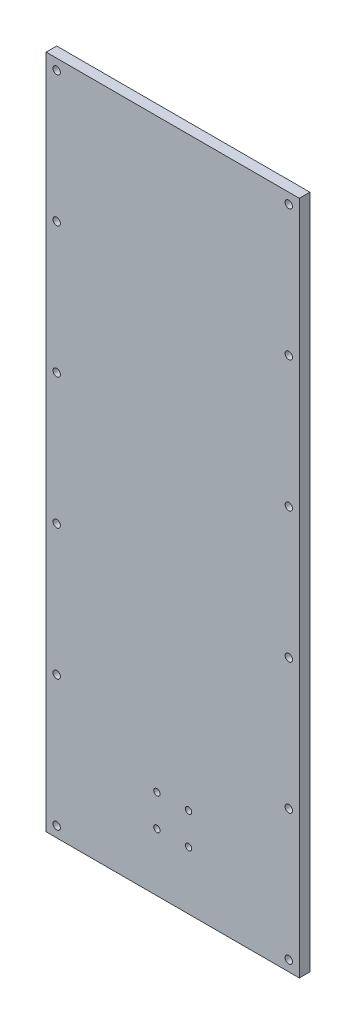
ISO-10303-21;
HEADER;
FILE_DESCRIPTION(('STEP AP214'),'2;1');
FILE_NAME('part.step','',(''),(''),'','','');
FILE_SCHEMA(('AUTOMOTIVE_DESIGN { 1 0 10303 214 1 1 1 1 }'));
ENDSEC;
DATA;
#1=APPLICATION_CONTEXT('core data for automotive mechanical design processes');
#2=APPLICATION_PROTOCOL_DEFINITION('international standard','automotive_design',2000,#1);
#3=PRODUCT_CONTEXT('',#1,'mechanical');
#4=PRODUCT('Part','Part','',(#3));
#5=PRODUCT_RELATED_PRODUCT_CATEGORY('part','',(#4));
#6=PRODUCT_DEFINITION_FORMATION('','',#4);
#7=PRODUCT_DEFINITION_CONTEXT('part definition',#1,'design');
#8=PRODUCT_DEFINITION('design','',#6,#7);
#9=PRODUCT_DEFINITION_SHAPE('','',#8);
#10=(LENGTH_UNIT() NAMED_UNIT(*) SI_UNIT(.MILLI.,.METRE.));
#11=(NAMED_UNIT(*) PLANE_ANGLE_UNIT() SI_UNIT($,.RADIAN.));
#12=(NAMED_UNIT(*) SI_UNIT($,.STERADIAN.) SOLID_ANGLE_UNIT());
#13=UNCERTAINTY_MEASURE_WITH_UNIT(LENGTH_MEASURE(1.E-05),#10,'distance_accuracy_value','');
#14=(GEOMETRIC_REPRESENTATION_CONTEXT(3) GLOBAL_UNCERTAINTY_ASSIGNED_CONTEXT((#13)) GLOBAL_UNIT_ASSIGNED_CONTEXT((#10,
#11,#12)) REPRESENTATION_CONTEXT('',''));
#15=CARTESIAN_POINT('',(0.,0.,0.));
#16=DIRECTION('',(0.,0.,1.));
#17=DIRECTION('',(1.,0.,0.));
#18=AXIS2_PLACEMENT_3D('',#15,#16,#17);
#19=CARTESIAN_POINT('',(-60.,-160.,5.));
#20=DIRECTION('',(1.,0.,0.));
#21=DIRECTION('',(0.,0.,-1.));
#22=AXIS2_PLACEMENT_3D('',#19,#20,#21);
#23=PLANE('',#22);
#24=DIRECTION('',(0.,-1.,0.));
#25=VECTOR('',#24,1.);
#26=CARTESIAN_POINT('',(-60.,-160.,0.));
#27=LINE('',#26,#25);
#28=CARTESIAN_POINT('',(-60.,160.,0.));
#29=VERTEX_POINT('',#28);
#30=CARTESIAN_POINT('',(-60.,-160.,0.));
#31=VERTEX_POINT('',#30);
#32=EDGE_CURVE('E101',#29,#31,#27,.T.);
#33=ORIENTED_EDGE('',*,*,#32,.T.);
#34=DIRECTION('',(0.,0.,-1.));
#35=VECTOR('',#34,1.);
#36=CARTESIAN_POINT('',(-60.,-160.,5.));
#37=LINE('',#36,#35);
#38=CARTESIAN_POINT('',(-60.,-160.,5.));
#39=VERTEX_POINT('',#38);
#40=EDGE_CURVE('E11',#39,#31,#37,.T.);
#41=ORIENTED_EDGE('',*,*,#40,.F.);
#42=DIRECTION('',(0.,-1.,0.));
#43=VECTOR('',#42,1.);
#44=CARTESIAN_POINT('',(-60.,-160.,5.));
#45=LINE('',#44,#43);
#46=CARTESIAN_POINT('',(-60.,160.,5.));
#47=VERTEX_POINT('',#46);
#48=EDGE_CURVE('E88',#47,#39,#45,.T.);
#49=ORIENTED_EDGE('',*,*,#48,.F.);
#50=DIRECTION('',(0.,0.,-1.));
#51=VECTOR('',#50,1.);
#52=CARTESIAN_POINT('',(-60.,160.,5.));
#53=LINE('',#52,#51);
#54=EDGE_CURVE('E97',#47,#29,#53,.T.);
#55=ORIENTED_EDGE('',*,*,#54,.T.);
#56=EDGE_LOOP('',(#33,#41,#49,#55));
#57=FACE_BOUND('',#56,.T.);
#58=ADVANCED_FACE('F35',(#57),#23,.F.);
#59=CARTESIAN_POINT('',(60.,-160.,5.));
#60=DIRECTION('',(0.,1.,0.));
#61=DIRECTION('',(0.,0.,1.));
#62=AXIS2_PLACEMENT_3D('',#59,#60,#61);
#63=PLANE('',#62);
#64=DIRECTION('',(1.,0.,0.));
#65=VECTOR('',#64,1.);
#66=CARTESIAN_POINT('',(60.,-160.,0.));
#67=LINE('',#66,#65);
#68=CARTESIAN_POINT('',(60.,-160.,0.));
#69=VERTEX_POINT('',#68);
#70=EDGE_CURVE('E92',#31,#69,#67,.T.);
#71=ORIENTED_EDGE('',*,*,#70,.T.);
#72=DIRECTION('',(0.,0.,-1.));
#73=VECTOR('',#72,1.);
#74=CARTESIAN_POINT('',(60.,-160.,5.));
#75=LINE('',#74,#73);
#76=CARTESIAN_POINT('',(60.,-160.,5.));
#77=VERTEX_POINT('',#76);
#78=EDGE_CURVE('E44',#77,#69,#75,.T.);
#79=ORIENTED_EDGE('',*,*,#78,.F.);
#80=DIRECTION('',(1.,0.,0.));
#81=VECTOR('',#80,1.);
#82=CARTESIAN_POINT('',(60.,-160.,5.));
#83=LINE('',#82,#81);
#84=EDGE_CURVE('E83',#39,#77,#83,.T.);
#85=ORIENTED_EDGE('',*,*,#84,.F.);
#86=ORIENTED_EDGE('',*,*,#40,.T.);
#87=EDGE_LOOP('',(#71,#79,#85,#86));
#88=FACE_BOUND('',#87,.T.);
#89=ADVANCED_FACE('F91',(#88),#63,.F.);
#90=CARTESIAN_POINT('',(60.,-160.,5.));
#91=DIRECTION('',(-1.,0.,0.));
#92=DIRECTION('',(0.,0.,1.));
#93=AXIS2_PLACEMENT_3D('',#90,#91,#92);
#94=PLANE('',#93);
#95=DIRECTION('',(0.,1.,0.));
#96=VECTOR('',#95,1.);
#97=CARTESIAN_POINT('',(60.,-160.,0.));
#98=LINE('',#97,#96);
#99=CARTESIAN_POINT('',(60.,160.,0.));
#100=VERTEX_POINT('',#99);
#101=EDGE_CURVE('E70',#69,#100,#98,.T.);
#102=ORIENTED_EDGE('',*,*,#101,.T.);
#103=DIRECTION('',(0.,0.,-1.));
#104=VECTOR('',#103,1.);
#105=CARTESIAN_POINT('',(60.,160.,5.));
#106=LINE('',#105,#104);
#107=CARTESIAN_POINT('',(60.,160.,5.));
#108=VERTEX_POINT('',#107);
#109=EDGE_CURVE('E93',#108,#100,#106,.T.);
#110=ORIENTED_EDGE('',*,*,#109,.F.);
#111=DIRECTION('',(0.,1.,0.));
#112=VECTOR('',#111,1.);
#113=CARTESIAN_POINT('',(60.,-160.,5.));
#114=LINE('',#113,#112);
#115=EDGE_CURVE('E86',#77,#108,#114,.T.);
#116=ORIENTED_EDGE('',*,*,#115,.F.);
#117=ORIENTED_EDGE('',*,*,#78,.T.);
#118=EDGE_LOOP('',(#102,#110,#116,#117));
#119=FACE_BOUND('',#118,.T.);
#120=ADVANCED_FACE('F95',(#119),#94,.F.);
#121=CARTESIAN_POINT('',(60.,160.,5.));
#122=DIRECTION('',(0.,-1.,0.));
#123=DIRECTION('',(0.,0.,-1.));
#124=AXIS2_PLACEMENT_3D('',#121,#122,#123);
#125=PLANE('',#124);
#126=DIRECTION('',(-1.,0.,0.));
#127=VECTOR('',#126,1.);
#128=CARTESIAN_POINT('',(60.,160.,0.));
#129=LINE('',#128,#127);
#130=EDGE_CURVE('E76',#100,#29,#129,.T.);
#131=ORIENTED_EDGE('',*,*,#130,.T.);
#132=ORIENTED_EDGE('',*,*,#54,.F.);
#133=DIRECTION('',(-1.,0.,0.));
#134=VECTOR('',#133,1.);
#135=CARTESIAN_POINT('',(60.,160.,5.));
#136=LINE('',#135,#134);
#137=EDGE_CURVE('E53',#108,#47,#136,.T.);
#138=ORIENTED_EDGE('',*,*,#137,.F.);
#139=ORIENTED_EDGE('',*,*,#109,.T.);
#140=EDGE_LOOP('',(#131,#132,#138,#139));
#141=FACE_BOUND('',#140,.T.);
#142=ADVANCED_FACE('F190',(#141),#125,.F.);
#143=CARTESIAN_POINT('',(0.,0.,5.));
#144=DIRECTION('',(0.,0.,1.));
#145=DIRECTION('',(1.,0.,0.));
#146=AXIS2_PLACEMENT_3D('',#143,#144,#145);
#147=PLANE('',#146);
#148=CARTESIAN_POINT('',(55.,93.,5.));
#149=DIRECTION('',(0.,0.,1.));
#150=DIRECTION('',(-1.,0.,0.));
#151=AXIS2_PLACEMENT_3D('',#148,#149,#150);
#152=CIRCLE('',#151,1.74759299465095);
#153=CARTESIAN_POINT('',(53.2524070053491,93.,5.));
#154=VERTEX_POINT('',#153);
#155=EDGE_CURVE('E415',#154,#154,#152,.T.);
#156=ORIENTED_EDGE('',*,*,#155,.F.);
#157=EDGE_LOOP('',(#156));
#158=FACE_BOUND('',#157,.T.);
#159=CARTESIAN_POINT('',(55.,-155.,5.));
#160=DIRECTION('',(0.,0.,1.));
#161=DIRECTION('',(-1.,0.,0.));
#162=AXIS2_PLACEMENT_3D('',#159,#160,#161);
#163=CIRCLE('',#162,1.74759299465095);
#164=CARTESIAN_POINT('',(53.2524070053491,-155.,5.));
#165=VERTEX_POINT('',#164);
#166=EDGE_CURVE('E409',#165,#165,#163,.T.);
#167=ORIENTED_EDGE('',*,*,#166,.F.);
#168=EDGE_LOOP('',(#167));
#169=FACE_BOUND('',#168,.T.);
#170=CARTESIAN_POINT('',(-55.,-155.,5.));
#171=DIRECTION('',(0.,0.,1.));
#172=DIRECTION('',(1.,0.,0.));
#173=AXIS2_PLACEMENT_3D('',#170,#171,#172);
#174=CIRCLE('',#173,1.74759299465095);
#175=CARTESIAN_POINT('',(-53.2524070053491,-155.,5.));
#176=VERTEX_POINT('',#175);
#177=EDGE_CURVE('E365',#176,#176,#174,.T.);
#178=ORIENTED_EDGE('',*,*,#177,.F.);
#179=EDGE_LOOP('',(#178));
#180=FACE_BOUND('',#179,.T.);
#181=CARTESIAN_POINT('',(-55.,-93.,5.));
#182=DIRECTION('',(0.,0.,1.));
#183=DIRECTION('',(1.,0.,0.));
#184=AXIS2_PLACEMENT_3D('',#181,#182,#183);
#185=CIRCLE('',#184,1.74759299465095);
#186=CARTESIAN_POINT('',(-53.252407005349,-93.,5.));
#187=VERTEX_POINT('',#186);
#188=EDGE_CURVE('E408',#187,#187,#185,.T.);
#189=ORIENTED_EDGE('',*,*,#188,.F.);
#190=EDGE_LOOP('',(#189));
#191=FACE_BOUND('',#190,.T.);
#192=CARTESIAN_POINT('',(-55.,-31.,5.));
#193=DIRECTION('',(0.,0.,1.));
#194=DIRECTION('',(1.,0.,0.));
#195=AXIS2_PLACEMENT_3D('',#192,#193,#194);
#196=CIRCLE('',#195,1.74759299465095);
#197=CARTESIAN_POINT('',(-53.252407005349,-31.,5.));
#198=VERTEX_POINT('',#197);
#199=EDGE_CURVE('E412',#198,#198,#196,.T.);
#200=ORIENTED_EDGE('',*,*,#199,.F.);
#201=EDGE_LOOP('',(#200));
#202=FACE_BOUND('',#201,.T.);
#203=CARTESIAN_POINT('',(-55.,31.,5.));
#204=DIRECTION('',(0.,0.,1.));
#205=DIRECTION('',(1.,0.,0.));
#206=AXIS2_PLACEMENT_3D('',#203,#204,#205);
#207=CIRCLE('',#206,1.74759299465095);
#208=CARTESIAN_POINT('',(-53.252407005349,31.,5.));
#209=VERTEX_POINT('',#208);
#210=EDGE_CURVE('E427',#209,#209,#207,.T.);
#211=ORIENTED_EDGE('',*,*,#210,.F.);
#212=EDGE_LOOP('',(#211));
#213=FACE_BOUND('',#212,.T.);
#214=CARTESIAN_POINT('',(-55.,93.,5.));
#215=DIRECTION('',(0.,0.,1.));
#216=DIRECTION('',(1.,0.,0.));
#217=AXIS2_PLACEMENT_3D('',#214,#215,#216);
#218=CIRCLE('',#217,1.74759299465095);
#219=CARTESIAN_POINT('',(-53.2524070053491,93.,5.));
#220=VERTEX_POINT('',#219);
#221=EDGE_CURVE('E424',#220,#220,#218,.T.);
#222=ORIENTED_EDGE('',*,*,#221,.F.);
#223=EDGE_LOOP('',(#222));
#224=FACE_BOUND('',#223,.T.);
#225=CARTESIAN_POINT('',(55.,155.,5.));
#226=DIRECTION('',(0.,0.,1.));
#227=DIRECTION('',(1.,0.,0.));
#228=AXIS2_PLACEMENT_3D('',#225,#226,#227);
#229=CIRCLE('',#228,1.74759299465095);
#230=CARTESIAN_POINT('',(56.747592994651,155.,5.));
#231=VERTEX_POINT('',#230);
#232=EDGE_CURVE('E421',#231,#231,#229,.T.);
#233=ORIENTED_EDGE('',*,*,#232,.F.);
#234=EDGE_LOOP('',(#233));
#235=FACE_BOUND('',#234,.T.);
#236=CARTESIAN_POINT('',(-7.5,-132.5,5.));
#237=DIRECTION('',(0.,0.,1.));
#238=DIRECTION('',(1.,0.,0.));
#239=AXIS2_PLACEMENT_3D('',#236,#237,#238);
#240=CIRCLE('',#239,1.5);
#241=CARTESIAN_POINT('',(-6.,-132.5,5.));
#242=VERTEX_POINT('',#241);
#243=EDGE_CURVE('E447',#242,#242,#240,.T.);
#244=ORIENTED_EDGE('',*,*,#243,.F.);
#245=EDGE_LOOP('',(#244));
#246=FACE_BOUND('',#245,.T.);
#247=CARTESIAN_POINT('',(7.5,-132.5,5.));
#248=DIRECTION('',(0.,0.,1.));
#249=DIRECTION('',(1.,0.,0.));
#250=AXIS2_PLACEMENT_3D('',#247,#248,#249);
#251=CIRCLE('',#250,1.5);
#252=CARTESIAN_POINT('',(9.,-132.5,5.));
#253=VERTEX_POINT('',#252);
#254=EDGE_CURVE('E451',#253,#253,#251,.T.);
#255=ORIENTED_EDGE('',*,*,#254,.F.);
#256=EDGE_LOOP('',(#255));
#257=FACE_BOUND('',#256,.T.);
#258=CARTESIAN_POINT('',(7.5,-117.5,5.));
#259=DIRECTION('',(0.,0.,1.));
#260=DIRECTION('',(1.,0.,0.));
#261=AXIS2_PLACEMENT_3D('',#258,#259,#260);
#262=CIRCLE('',#261,1.5);
#263=CARTESIAN_POINT('',(9.,-117.5,5.));
#264=VERTEX_POINT('',#263);
#265=EDGE_CURVE('E455',#264,#264,#262,.T.);
#266=ORIENTED_EDGE('',*,*,#265,.F.);
#267=EDGE_LOOP('',(#266));
#268=FACE_BOUND('',#267,.T.);
#269=CARTESIAN_POINT('',(-7.5,-117.5,5.));
#270=DIRECTION('',(0.,0.,1.));
#271=DIRECTION('',(1.,0.,0.));
#272=AXIS2_PLACEMENT_3D('',#269,#270,#271);
#273=CIRCLE('',#272,1.5);
#274=CARTESIAN_POINT('',(-6.,-117.5,5.));
#275=VERTEX_POINT('',#274);
#276=EDGE_CURVE('E459',#275,#275,#273,.T.);
#277=ORIENTED_EDGE('',*,*,#276,.F.);
#278=EDGE_LOOP('',(#277));
#279=FACE_BOUND('',#278,.T.);
#280=CARTESIAN_POINT('',(55.,-93.,5.));
#281=DIRECTION('',(0.,0.,1.));
#282=DIRECTION('',(-1.,0.,0.));
#283=AXIS2_PLACEMENT_3D('',#280,#281,#282);
#284=CIRCLE('',#283,1.74759299465095);
#285=CARTESIAN_POINT('',(53.252407005349,-93.,5.));
#286=VERTEX_POINT('',#285);
#287=EDGE_CURVE('E463',#286,#286,#284,.T.);
#288=ORIENTED_EDGE('',*,*,#287,.F.);
#289=EDGE_LOOP('',(#288));
#290=FACE_BOUND('',#289,.T.);
#291=CARTESIAN_POINT('',(55.,-31.,5.));
#292=DIRECTION('',(0.,0.,1.));
#293=DIRECTION('',(-1.,0.,0.));
#294=AXIS2_PLACEMENT_3D('',#291,#292,#293);
#295=CIRCLE('',#294,1.74759299465095);
#296=CARTESIAN_POINT('',(53.252407005349,-31.,5.));
#297=VERTEX_POINT('',#296);
#298=EDGE_CURVE('E467',#297,#297,#295,.T.);
#299=ORIENTED_EDGE('',*,*,#298,.F.);
#300=EDGE_LOOP('',(#299));
#301=FACE_BOUND('',#300,.T.);
#302=CARTESIAN_POINT('',(55.,31.,5.));
#303=DIRECTION('',(0.,0.,1.));
#304=DIRECTION('',(-1.,0.,0.));
#305=AXIS2_PLACEMENT_3D('',#302,#303,#304);
#306=CIRCLE('',#305,1.74759299465095);
#307=CARTESIAN_POINT('',(53.252407005349,31.,5.));
#308=VERTEX_POINT('',#307);
#309=EDGE_CURVE('E420',#308,#308,#306,.T.);
#310=ORIENTED_EDGE('',*,*,#309,.F.);
#311=EDGE_LOOP('',(#310));
#312=FACE_BOUND('',#311,.T.);
#313=CARTESIAN_POINT('',(-55.,155.,5.));
#314=DIRECTION('',(0.,0.,1.));
#315=DIRECTION('',(1.,0.,0.));
#316=AXIS2_PLACEMENT_3D('',#313,#314,#315);
#317=CIRCLE('',#316,1.74759299465095);
#318=CARTESIAN_POINT('',(-53.2524070053491,155.,5.));
#319=VERTEX_POINT('',#318);
#320=EDGE_CURVE('E113',#319,#319,#317,.T.);
#321=ORIENTED_EDGE('',*,*,#320,.F.);
#322=EDGE_LOOP('',(#321));
#323=FACE_BOUND('',#322,.T.);
#324=ORIENTED_EDGE('',*,*,#48,.T.);
#325=ORIENTED_EDGE('',*,*,#84,.T.);
#326=ORIENTED_EDGE('',*,*,#115,.T.);
#327=ORIENTED_EDGE('',*,*,#137,.T.);
#328=EDGE_LOOP('',(#324,#325,#326,#327));
#329=FACE_BOUND('',#328,.T.);
#330=ADVANCED_FACE('F84',(#158,#169,#180,#191,#202,#213,#224,#235,#246,#257,#268,#279,#290,#301,
#312,#323,#329),#147,.T.);
#331=CARTESIAN_POINT('',(0.,0.,0.));
#332=DIRECTION('',(0.,0.,1.));
#333=DIRECTION('',(1.,0.,0.));
#334=AXIS2_PLACEMENT_3D('',#331,#332,#333);
#335=PLANE('',#334);
#336=CARTESIAN_POINT('',(55.,93.,0.));
#337=DIRECTION('',(0.,0.,1.));
#338=DIRECTION('',(1.,0.,0.));
#339=AXIS2_PLACEMENT_3D('',#336,#337,#338);
#340=CIRCLE('',#339,1.74759299465095);
#341=CARTESIAN_POINT('',(56.747592994651,93.,0.));
#342=VERTEX_POINT('',#341);
#343=EDGE_CURVE('E38',#342,#342,#340,.T.);
#344=ORIENTED_EDGE('',*,*,#343,.T.);
#345=EDGE_LOOP('',(#344));
#346=FACE_BOUND('',#345,.T.);
#347=CARTESIAN_POINT('',(55.,-155.,0.));
#348=DIRECTION('',(0.,0.,1.));
#349=DIRECTION('',(1.,0.,0.));
#350=AXIS2_PLACEMENT_3D('',#347,#348,#349);
#351=CIRCLE('',#350,1.74759299465095);
#352=CARTESIAN_POINT('',(56.747592994651,-155.,0.));
#353=VERTEX_POINT('',#352);
#354=EDGE_CURVE('E151',#353,#353,#351,.T.);
#355=ORIENTED_EDGE('',*,*,#354,.T.);
#356=EDGE_LOOP('',(#355));
#357=FACE_BOUND('',#356,.T.);
#358=CARTESIAN_POINT('',(-55.,-155.,0.));
#359=DIRECTION('',(0.,0.,1.));
#360=DIRECTION('',(1.,0.,0.));
#361=AXIS2_PLACEMENT_3D('',#358,#359,#360);
#362=CIRCLE('',#361,1.74759299465095);
#363=CARTESIAN_POINT('',(-53.2524070053491,-155.,0.));
#364=VERTEX_POINT('',#363);
#365=EDGE_CURVE('E149',#364,#364,#362,.T.);
#366=ORIENTED_EDGE('',*,*,#365,.T.);
#367=EDGE_LOOP('',(#366));
#368=FACE_BOUND('',#367,.T.);
#369=CARTESIAN_POINT('',(-55.,-93.,0.));
#370=DIRECTION('',(0.,0.,1.));
#371=DIRECTION('',(1.,0.,0.));
#372=AXIS2_PLACEMENT_3D('',#369,#370,#371);
#373=CIRCLE('',#372,1.74759299465095);
#374=CARTESIAN_POINT('',(-53.252407005349,-93.,0.));
#375=VERTEX_POINT('',#374);
#376=EDGE_CURVE('E146',#375,#375,#373,.T.);
#377=ORIENTED_EDGE('',*,*,#376,.T.);
#378=EDGE_LOOP('',(#377));
#379=FACE_BOUND('',#378,.T.);
#380=CARTESIAN_POINT('',(-55.,-31.,0.));
#381=DIRECTION('',(0.,0.,1.));
#382=DIRECTION('',(1.,0.,0.));
#383=AXIS2_PLACEMENT_3D('',#380,#381,#382);
#384=CIRCLE('',#383,1.74759299465095);
#385=CARTESIAN_POINT('',(-53.252407005349,-31.,0.));
#386=VERTEX_POINT('',#385);
#387=EDGE_CURVE('E143',#386,#386,#384,.T.);
#388=ORIENTED_EDGE('',*,*,#387,.T.);
#389=EDGE_LOOP('',(#388));
#390=FACE_BOUND('',#389,.T.);
#391=CARTESIAN_POINT('',(-55.,31.,0.));
#392=DIRECTION('',(0.,0.,1.));
#393=DIRECTION('',(1.,0.,0.));
#394=AXIS2_PLACEMENT_3D('',#391,#392,#393);
#395=CIRCLE('',#394,1.74759299465095);
#396=CARTESIAN_POINT('',(-53.252407005349,31.,0.));
#397=VERTEX_POINT('',#396);
#398=EDGE_CURVE('E140',#397,#397,#395,.T.);
#399=ORIENTED_EDGE('',*,*,#398,.T.);
#400=EDGE_LOOP('',(#399));
#401=FACE_BOUND('',#400,.T.);
#402=CARTESIAN_POINT('',(-55.,93.,0.));
#403=DIRECTION('',(0.,0.,1.));
#404=DIRECTION('',(1.,0.,0.));
#405=AXIS2_PLACEMENT_3D('',#402,#403,#404);
#406=CIRCLE('',#405,1.74759299465095);
#407=CARTESIAN_POINT('',(-53.2524070053491,93.,0.));
#408=VERTEX_POINT('',#407);
#409=EDGE_CURVE('E137',#408,#408,#406,.T.);
#410=ORIENTED_EDGE('',*,*,#409,.T.);
#411=EDGE_LOOP('',(#410));
#412=FACE_BOUND('',#411,.T.);
#413=CARTESIAN_POINT('',(55.,155.,0.));
#414=DIRECTION('',(0.,0.,1.));
#415=DIRECTION('',(1.,0.,0.));
#416=AXIS2_PLACEMENT_3D('',#413,#414,#415);
#417=CIRCLE('',#416,1.74759299465095);
#418=CARTESIAN_POINT('',(56.747592994651,155.,0.));
#419=VERTEX_POINT('',#418);
#420=EDGE_CURVE('E134',#419,#419,#417,.T.);
#421=ORIENTED_EDGE('',*,*,#420,.T.);
#422=EDGE_LOOP('',(#421));
#423=FACE_BOUND('',#422,.T.);
#424=CARTESIAN_POINT('',(-7.5,-132.5,0.));
#425=DIRECTION('',(0.,0.,1.));
#426=DIRECTION('',(1.,0.,0.));
#427=AXIS2_PLACEMENT_3D('',#424,#425,#426);
#428=CIRCLE('',#427,1.5);
#429=CARTESIAN_POINT('',(-6.,-132.5,0.));
#430=VERTEX_POINT('',#429);
#431=EDGE_CURVE('E131',#430,#430,#428,.T.);
#432=ORIENTED_EDGE('',*,*,#431,.T.);
#433=EDGE_LOOP('',(#432));
#434=FACE_BOUND('',#433,.T.);
#435=CARTESIAN_POINT('',(7.5,-132.5,0.));
#436=DIRECTION('',(0.,0.,1.));
#437=DIRECTION('',(1.,0.,0.));
#438=AXIS2_PLACEMENT_3D('',#435,#436,#437);
#439=CIRCLE('',#438,1.5);
#440=CARTESIAN_POINT('',(9.,-132.5,0.));
#441=VERTEX_POINT('',#440);
#442=EDGE_CURVE('E128',#441,#441,#439,.T.);
#443=ORIENTED_EDGE('',*,*,#442,.T.);
#444=EDGE_LOOP('',(#443));
#445=FACE_BOUND('',#444,.T.);
#446=CARTESIAN_POINT('',(7.5,-117.5,0.));
#447=DIRECTION('',(0.,0.,1.));
#448=DIRECTION('',(1.,0.,0.));
#449=AXIS2_PLACEMENT_3D('',#446,#447,#448);
#450=CIRCLE('',#449,1.5);
#451=CARTESIAN_POINT('',(9.,-117.5,0.));
#452=VERTEX_POINT('',#451);
#453=EDGE_CURVE('E125',#452,#452,#450,.T.);
#454=ORIENTED_EDGE('',*,*,#453,.T.);
#455=EDGE_LOOP('',(#454));
#456=FACE_BOUND('',#455,.T.);
#457=CARTESIAN_POINT('',(-7.5,-117.5,0.));
#458=DIRECTION('',(0.,0.,1.));
#459=DIRECTION('',(1.,0.,0.));
#460=AXIS2_PLACEMENT_3D('',#457,#458,#459);
#461=CIRCLE('',#460,1.5);
#462=CARTESIAN_POINT('',(-6.,-117.5,0.));
#463=VERTEX_POINT('',#462);
#464=EDGE_CURVE('E122',#463,#463,#461,.T.);
#465=ORIENTED_EDGE('',*,*,#464,.T.);
#466=EDGE_LOOP('',(#465));
#467=FACE_BOUND('',#466,.T.);
#468=CARTESIAN_POINT('',(55.,-93.,0.));
#469=DIRECTION('',(0.,0.,1.));
#470=DIRECTION('',(1.,0.,0.));
#471=AXIS2_PLACEMENT_3D('',#468,#469,#470);
#472=CIRCLE('',#471,1.74759299465095);
#473=CARTESIAN_POINT('',(56.7475929946509,-93.,0.));
#474=VERTEX_POINT('',#473);
#475=EDGE_CURVE('E119',#474,#474,#472,.T.);
#476=ORIENTED_EDGE('',*,*,#475,.T.);
#477=EDGE_LOOP('',(#476));
#478=FACE_BOUND('',#477,.T.);
#479=CARTESIAN_POINT('',(55.,-31.,0.));
#480=DIRECTION('',(0.,0.,1.));
#481=DIRECTION('',(1.,0.,0.));
#482=AXIS2_PLACEMENT_3D('',#479,#480,#481);
#483=CIRCLE('',#482,1.74759299465095);
#484=CARTESIAN_POINT('',(56.7475929946509,-31.,0.));
#485=VERTEX_POINT('',#484);
#486=EDGE_CURVE('E116',#485,#485,#483,.T.);
#487=ORIENTED_EDGE('',*,*,#486,.T.);
#488=EDGE_LOOP('',(#487));
#489=FACE_BOUND('',#488,.T.);
#490=CARTESIAN_POINT('',(55.,31.,0.));
#491=DIRECTION('',(0.,0.,1.));
#492=DIRECTION('',(1.,0.,0.));
#493=AXIS2_PLACEMENT_3D('',#490,#491,#492);
#494=CIRCLE('',#493,1.74759299465095);
#495=CARTESIAN_POINT('',(56.747592994651,31.,0.));
#496=VERTEX_POINT('',#495);
#497=EDGE_CURVE('E112',#496,#496,#494,.T.);
#498=ORIENTED_EDGE('',*,*,#497,.T.);
#499=EDGE_LOOP('',(#498));
#500=FACE_BOUND('',#499,.T.);
#501=CARTESIAN_POINT('',(-55.,155.,0.));
#502=DIRECTION('',(0.,0.,1.));
#503=DIRECTION('',(1.,0.,0.));
#504=AXIS2_PLACEMENT_3D('',#501,#502,#503);
#505=CIRCLE('',#504,1.74759299465095);
#506=CARTESIAN_POINT('',(-53.2524070053491,155.,0.));
#507=VERTEX_POINT('',#506);
#508=EDGE_CURVE('E109',#507,#507,#505,.T.);
#509=ORIENTED_EDGE('',*,*,#508,.T.);
#510=EDGE_LOOP('',(#509));
#511=FACE_BOUND('',#510,.T.);
#512=ORIENTED_EDGE('',*,*,#32,.F.);
#513=ORIENTED_EDGE('',*,*,#130,.F.);
#514=ORIENTED_EDGE('',*,*,#101,.F.);
#515=ORIENTED_EDGE('',*,*,#70,.F.);
#516=EDGE_LOOP('',(#512,#513,#514,#515));
#517=FACE_BOUND('',#516,.T.);
#518=ADVANCED_FACE('F158',(#346,#357,#368,#379,#390,#401,#412,#423,#434,#445,#456,#467,#478,
#489,#500,#511,#517),#335,.F.);
#519=CARTESIAN_POINT('',(-55.,155.,-5.));
#520=DIRECTION('',(0.,0.,1.));
#521=DIRECTION('',(1.,0.,0.));
#522=AXIS2_PLACEMENT_3D('',#519,#520,#521);
#523=CYLINDRICAL_SURFACE('',#522,1.74759299465095);
#524=ORIENTED_EDGE('',*,*,#320,.T.);
#525=EDGE_LOOP('',(#524));
#526=FACE_BOUND('',#525,.T.);
#527=ORIENTED_EDGE('',*,*,#508,.F.);
#528=EDGE_LOOP('',(#527));
#529=FACE_BOUND('',#528,.T.);
#530=ADVANCED_FACE('F181',(#526,#529),#523,.F.);
#531=CARTESIAN_POINT('',(55.,31.,-5.));
#532=DIRECTION('',(0.,0.,1.));
#533=DIRECTION('',(1.,0.,0.));
#534=AXIS2_PLACEMENT_3D('',#531,#532,#533);
#535=CYLINDRICAL_SURFACE('',#534,1.74759299465095);
#536=ORIENTED_EDGE('',*,*,#309,.T.);
#537=EDGE_LOOP('',(#536));
#538=FACE_BOUND('',#537,.T.);
#539=ORIENTED_EDGE('',*,*,#497,.F.);
#540=EDGE_LOOP('',(#539));
#541=FACE_BOUND('',#540,.T.);
#542=ADVANCED_FACE('F187',(#538,#541),#535,.F.);
#543=CARTESIAN_POINT('',(55.,-31.,-5.));
#544=DIRECTION('',(0.,0.,1.));
#545=DIRECTION('',(1.,0.,0.));
#546=AXIS2_PLACEMENT_3D('',#543,#544,#545);
#547=CYLINDRICAL_SURFACE('',#546,1.74759299465095);
#548=ORIENTED_EDGE('',*,*,#298,.T.);
#549=EDGE_LOOP('',(#548));
#550=FACE_BOUND('',#549,.T.);
#551=ORIENTED_EDGE('',*,*,#486,.F.);
#552=EDGE_LOOP('',(#551));
#553=FACE_BOUND('',#552,.T.);
#554=ADVANCED_FACE('F230',(#550,#553),#547,.F.);
#555=CARTESIAN_POINT('',(55.,-93.,-5.));
#556=DIRECTION('',(0.,0.,1.));
#557=DIRECTION('',(1.,0.,0.));
#558=AXIS2_PLACEMENT_3D('',#555,#556,#557);
#559=CYLINDRICAL_SURFACE('',#558,1.74759299465095);
#560=ORIENTED_EDGE('',*,*,#287,.T.);
#561=EDGE_LOOP('',(#560));
#562=FACE_BOUND('',#561,.T.);
#563=ORIENTED_EDGE('',*,*,#475,.F.);
#564=EDGE_LOOP('',(#563));
#565=FACE_BOUND('',#564,.T.);
#566=ADVANCED_FACE('F240',(#562,#565),#559,.F.);
#567=CARTESIAN_POINT('',(-7.5,-117.5,-5.));
#568=DIRECTION('',(0.,0.,1.));
#569=DIRECTION('',(1.,0.,0.));
#570=AXIS2_PLACEMENT_3D('',#567,#568,#569);
#571=CYLINDRICAL_SURFACE('',#570,1.5);
#572=ORIENTED_EDGE('',*,*,#276,.T.);
#573=EDGE_LOOP('',(#572));
#574=FACE_BOUND('',#573,.T.);
#575=ORIENTED_EDGE('',*,*,#464,.F.);
#576=EDGE_LOOP('',(#575));
#577=FACE_BOUND('',#576,.T.);
#578=ADVANCED_FACE('F250',(#574,#577),#571,.F.);
#579=CARTESIAN_POINT('',(7.5,-117.5,-5.));
#580=DIRECTION('',(0.,0.,1.));
#581=DIRECTION('',(1.,0.,0.));
#582=AXIS2_PLACEMENT_3D('',#579,#580,#581);
#583=CYLINDRICAL_SURFACE('',#582,1.5);
#584=ORIENTED_EDGE('',*,*,#265,.T.);
#585=EDGE_LOOP('',(#584));
#586=FACE_BOUND('',#585,.T.);
#587=ORIENTED_EDGE('',*,*,#453,.F.);
#588=EDGE_LOOP('',(#587));
#589=FACE_BOUND('',#588,.T.);
#590=ADVANCED_FACE('F260',(#586,#589),#583,.F.);
#591=CARTESIAN_POINT('',(7.5,-132.5,-5.));
#592=DIRECTION('',(0.,0.,1.));
#593=DIRECTION('',(1.,0.,0.));
#594=AXIS2_PLACEMENT_3D('',#591,#592,#593);
#595=CYLINDRICAL_SURFACE('',#594,1.5);
#596=ORIENTED_EDGE('',*,*,#254,.T.);
#597=EDGE_LOOP('',(#596));
#598=FACE_BOUND('',#597,.T.);
#599=ORIENTED_EDGE('',*,*,#442,.F.);
#600=EDGE_LOOP('',(#599));
#601=FACE_BOUND('',#600,.T.);
#602=ADVANCED_FACE('F270',(#598,#601),#595,.F.);
#603=CARTESIAN_POINT('',(-7.5,-132.5,-5.));
#604=DIRECTION('',(0.,0.,1.));
#605=DIRECTION('',(1.,0.,0.));
#606=AXIS2_PLACEMENT_3D('',#603,#604,#605);
#607=CYLINDRICAL_SURFACE('',#606,1.5);
#608=ORIENTED_EDGE('',*,*,#243,.T.);
#609=EDGE_LOOP('',(#608));
#610=FACE_BOUND('',#609,.T.);
#611=ORIENTED_EDGE('',*,*,#431,.F.);
#612=EDGE_LOOP('',(#611));
#613=FACE_BOUND('',#612,.T.);
#614=ADVANCED_FACE('F280',(#610,#613),#607,.F.);
#615=CARTESIAN_POINT('',(55.,155.,-5.));
#616=DIRECTION('',(0.,0.,1.));
#617=DIRECTION('',(1.,0.,0.));
#618=AXIS2_PLACEMENT_3D('',#615,#616,#617);
#619=CYLINDRICAL_SURFACE('',#618,1.74759299465095);
#620=ORIENTED_EDGE('',*,*,#232,.T.);
#621=EDGE_LOOP('',(#620));
#622=FACE_BOUND('',#621,.T.);
#623=ORIENTED_EDGE('',*,*,#420,.F.);
#624=EDGE_LOOP('',(#623));
#625=FACE_BOUND('',#624,.T.);
#626=ADVANCED_FACE('F290',(#622,#625),#619,.F.);
#627=CARTESIAN_POINT('',(-55.,93.,-5.));
#628=DIRECTION('',(0.,0.,1.));
#629=DIRECTION('',(1.,0.,0.));
#630=AXIS2_PLACEMENT_3D('',#627,#628,#629);
#631=CYLINDRICAL_SURFACE('',#630,1.74759299465095);
#632=ORIENTED_EDGE('',*,*,#221,.T.);
#633=EDGE_LOOP('',(#632));
#634=FACE_BOUND('',#633,.T.);
#635=ORIENTED_EDGE('',*,*,#409,.F.);
#636=EDGE_LOOP('',(#635));
#637=FACE_BOUND('',#636,.T.);
#638=ADVANCED_FACE('F300',(#634,#637),#631,.F.);
#639=CARTESIAN_POINT('',(-55.,31.,-5.));
#640=DIRECTION('',(0.,0.,1.));
#641=DIRECTION('',(1.,0.,0.));
#642=AXIS2_PLACEMENT_3D('',#639,#640,#641);
#643=CYLINDRICAL_SURFACE('',#642,1.74759299465095);
#644=ORIENTED_EDGE('',*,*,#210,.T.);
#645=EDGE_LOOP('',(#644));
#646=FACE_BOUND('',#645,.T.);
#647=ORIENTED_EDGE('',*,*,#398,.F.);
#648=EDGE_LOOP('',(#647));
#649=FACE_BOUND('',#648,.T.);
#650=ADVANCED_FACE('F309',(#646,#649),#643,.F.);
#651=CARTESIAN_POINT('',(-55.,-31.,-5.));
#652=DIRECTION('',(0.,0.,1.));
#653=DIRECTION('',(1.,0.,0.));
#654=AXIS2_PLACEMENT_3D('',#651,#652,#653);
#655=CYLINDRICAL_SURFACE('',#654,1.74759299465095);
#656=ORIENTED_EDGE('',*,*,#199,.T.);
#657=EDGE_LOOP('',(#656));
#658=FACE_BOUND('',#657,.T.);
#659=ORIENTED_EDGE('',*,*,#387,.F.);
#660=EDGE_LOOP('',(#659));
#661=FACE_BOUND('',#660,.T.);
#662=ADVANCED_FACE('F319',(#658,#661),#655,.F.);
#663=CARTESIAN_POINT('',(-55.,-93.,-5.));
#664=DIRECTION('',(0.,0.,1.));
#665=DIRECTION('',(1.,0.,0.));
#666=AXIS2_PLACEMENT_3D('',#663,#664,#665);
#667=CYLINDRICAL_SURFACE('',#666,1.74759299465095);
#668=ORIENTED_EDGE('',*,*,#188,.T.);
#669=EDGE_LOOP('',(#668));
#670=FACE_BOUND('',#669,.T.);
#671=ORIENTED_EDGE('',*,*,#376,.F.);
#672=EDGE_LOOP('',(#671));
#673=FACE_BOUND('',#672,.T.);
#674=ADVANCED_FACE('F329',(#670,#673),#667,.F.);
#675=CARTESIAN_POINT('',(-55.,-155.,-5.));
#676=DIRECTION('',(0.,0.,1.));
#677=DIRECTION('',(1.,0.,0.));
#678=AXIS2_PLACEMENT_3D('',#675,#676,#677);
#679=CYLINDRICAL_SURFACE('',#678,1.74759299465095);
#680=ORIENTED_EDGE('',*,*,#177,.T.);
#681=EDGE_LOOP('',(#680));
#682=FACE_BOUND('',#681,.T.);
#683=ORIENTED_EDGE('',*,*,#365,.F.);
#684=EDGE_LOOP('',(#683));
#685=FACE_BOUND('',#684,.T.);
#686=ADVANCED_FACE('F168',(#682,#685),#679,.F.);
#687=CARTESIAN_POINT('',(55.,-155.,-5.));
#688=DIRECTION('',(0.,0.,1.));
#689=DIRECTION('',(1.,0.,0.));
#690=AXIS2_PLACEMENT_3D('',#687,#688,#689);
#691=CYLINDRICAL_SURFACE('',#690,1.74759299465095);
#692=ORIENTED_EDGE('',*,*,#166,.T.);
#693=EDGE_LOOP('',(#692));
#694=FACE_BOUND('',#693,.T.);
#695=ORIENTED_EDGE('',*,*,#354,.F.);
#696=EDGE_LOOP('',(#695));
#697=FACE_BOUND('',#696,.T.);
#698=ADVANCED_FACE('F162',(#694,#697),#691,.F.);
#699=CARTESIAN_POINT('',(55.,93.,-5.));
#700=DIRECTION('',(0.,0.,1.));
#701=DIRECTION('',(1.,0.,0.));
#702=AXIS2_PLACEMENT_3D('',#699,#700,#701);
#703=CYLINDRICAL_SURFACE('',#702,1.74759299465095);
#704=ORIENTED_EDGE('',*,*,#155,.T.);
#705=EDGE_LOOP('',(#704));
#706=FACE_BOUND('',#705,.T.);
#707=ORIENTED_EDGE('',*,*,#343,.F.);
#708=EDGE_LOOP('',(#707));
#709=FACE_BOUND('',#708,.T.);
#710=ADVANCED_FACE('F160',(#706,#709),#703,.F.);
#711=CLOSED_SHELL('',(#58,#89,#120,#142,#330,#518,#530,#542,#554,#566,#578,#590,#602,#614,#626,
#638,#650,#662,#674,#686,#698,#710));
#712=MANIFOLD_SOLID_BREP('B2',#711);
#713=ADVANCED_BREP_SHAPE_REPRESENTATION('',(#18,#712),#14);
#714=SHAPE_DEFINITION_REPRESENTATION(#9,#713);
ENDSEC;
END-ISO-10303-21;
